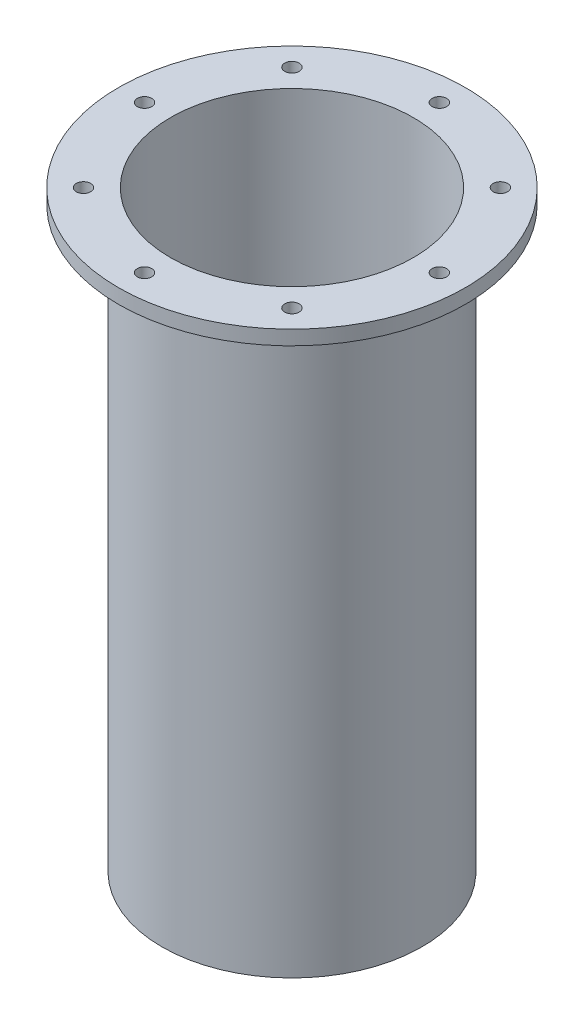
ISO-10303-21;
HEADER;
FILE_DESCRIPTION(('STEP AP214'),'2;1');
FILE_NAME('part.step','',(''),(''),'','','');
FILE_SCHEMA(('AUTOMOTIVE_DESIGN { 1 0 10303 214 1 1 1 1 }'));
ENDSEC;
DATA;
#1=APPLICATION_CONTEXT('core data for automotive mechanical design processes');
#2=APPLICATION_PROTOCOL_DEFINITION('international standard','automotive_design',2000,#1);
#3=PRODUCT_CONTEXT('',#1,'mechanical');
#4=PRODUCT('Part','Part','',(#3));
#5=PRODUCT_RELATED_PRODUCT_CATEGORY('part','',(#4));
#6=PRODUCT_DEFINITION_FORMATION('','',#4);
#7=PRODUCT_DEFINITION_CONTEXT('part definition',#1,'design');
#8=PRODUCT_DEFINITION('design','',#6,#7);
#9=PRODUCT_DEFINITION_SHAPE('','',#8);
#10=(LENGTH_UNIT() NAMED_UNIT(*) SI_UNIT(.MILLI.,.METRE.));
#11=(NAMED_UNIT(*) PLANE_ANGLE_UNIT() SI_UNIT($,.RADIAN.));
#12=(NAMED_UNIT(*) SI_UNIT($,.STERADIAN.) SOLID_ANGLE_UNIT());
#13=UNCERTAINTY_MEASURE_WITH_UNIT(LENGTH_MEASURE(1.E-05),#10,'distance_accuracy_value','');
#14=(GEOMETRIC_REPRESENTATION_CONTEXT(3) GLOBAL_UNCERTAINTY_ASSIGNED_CONTEXT((#13)) GLOBAL_UNIT_ASSIGNED_CONTEXT((#10,
#11,#12)) REPRESENTATION_CONTEXT('',''));
#15=CARTESIAN_POINT('',(0.,0.,0.));
#16=DIRECTION('',(0.,0.,1.));
#17=DIRECTION('',(1.,0.,0.));
#18=AXIS2_PLACEMENT_3D('',#15,#16,#17);
#19=CARTESIAN_POINT('',(0.,-260.35,0.));
#20=DIRECTION('',(0.,1.,0.));
#21=DIRECTION('',(0.,0.,1.));
#22=AXIS2_PLACEMENT_3D('',#19,#20,#21);
#23=CYLINDRICAL_SURFACE('',#22,57.15);
#24=CARTESIAN_POINT('',(0.,-260.35,0.));
#25=DIRECTION('',(0.,1.,0.));
#26=DIRECTION('',(0.,0.,1.));
#27=AXIS2_PLACEMENT_3D('',#24,#25,#26);
#28=CIRCLE('',#27,57.15);
#29=CARTESIAN_POINT('',(0.,-260.35,57.15));
#30=VERTEX_POINT('',#29);
#31=EDGE_CURVE('E10',#30,#30,#28,.T.);
#32=ORIENTED_EDGE('',*,*,#31,.T.);
#33=EDGE_LOOP('',(#32));
#34=FACE_BOUND('',#33,.T.);
#35=CARTESIAN_POINT('',(0.,-6.35,0.));
#36=DIRECTION('',(0.,1.,0.));
#37=DIRECTION('',(0.,0.,1.));
#38=AXIS2_PLACEMENT_3D('',#35,#36,#37);
#39=CIRCLE('',#38,57.15);
#40=CARTESIAN_POINT('',(0.,-6.35,57.15));
#41=VERTEX_POINT('',#40);
#42=EDGE_CURVE('E53',#41,#41,#39,.T.);
#43=ORIENTED_EDGE('',*,*,#42,.F.);
#44=EDGE_LOOP('',(#43));
#45=FACE_BOUND('',#44,.T.);
#46=ADVANCED_FACE('F33',(#34,#45),#23,.T.);
#47=CARTESIAN_POINT('',(0.,-260.35,0.));
#48=DIRECTION('',(0.,1.,0.));
#49=DIRECTION('',(0.,0.,1.));
#50=AXIS2_PLACEMENT_3D('',#47,#48,#49);
#51=PLANE('',#50);
#52=CARTESIAN_POINT('',(0.,-260.35,0.));
#53=DIRECTION('',(0.,1.,0.));
#54=DIRECTION('',(0.,0.,1.));
#55=AXIS2_PLACEMENT_3D('',#52,#53,#54);
#56=CIRCLE('',#55,53.34);
#57=CARTESIAN_POINT('',(0.,-260.35,53.34));
#58=VERTEX_POINT('',#57);
#59=EDGE_CURVE('E39',#58,#58,#56,.T.);
#60=ORIENTED_EDGE('',*,*,#59,.T.);
#61=EDGE_LOOP('',(#60));
#62=FACE_BOUND('',#61,.T.);
#63=ORIENTED_EDGE('',*,*,#31,.F.);
#64=EDGE_LOOP('',(#63));
#65=FACE_BOUND('',#64,.T.);
#66=ADVANCED_FACE('F114',(#62,#65),#51,.F.);
#67=CARTESIAN_POINT('',(0.,0.,0.));
#68=DIRECTION('',(0.,1.,0.));
#69=DIRECTION('',(0.,0.,1.));
#70=AXIS2_PLACEMENT_3D('',#67,#68,#69);
#71=PLANE('',#70);
#72=CARTESIAN_POINT('',(64.77,0.,2.2614324631687E-13));
#73=DIRECTION('',(0.,1.,0.));
#74=DIRECTION('',(-1.,0.,0.));
#75=AXIS2_PLACEMENT_3D('',#72,#73,#74);
#76=CIRCLE('',#75,3.175);
#77=CARTESIAN_POINT('',(61.595,0.,2.15057793066043E-13));
#78=VERTEX_POINT('',#77);
#79=EDGE_CURVE('E88',#78,#78,#76,.T.);
#80=ORIENTED_EDGE('',*,*,#79,.F.);
#81=EDGE_LOOP('',(#80));
#82=FACE_BOUND('',#81,.T.);
#83=CARTESIAN_POINT('',(45.7993062174524,0.,45.7993062174529));
#84=DIRECTION('',(0.,1.,0.));
#85=DIRECTION('',(-0.707106781186544,0.,-0.707106781186551));
#86=AXIS2_PLACEMENT_3D('',#83,#84,#85);
#87=CIRCLE('',#86,3.175);
#88=CARTESIAN_POINT('',(43.5542421871852,0.,43.5542421871856));
#89=VERTEX_POINT('',#88);
#90=EDGE_CURVE('E82',#89,#89,#87,.T.);
#91=ORIENTED_EDGE('',*,*,#90,.F.);
#92=EDGE_LOOP('',(#91));
#93=FACE_BOUND('',#92,.T.);
#94=CARTESIAN_POINT('',(0.,0.,64.77));
#95=DIRECTION('',(0.,1.,0.));
#96=DIRECTION('',(0.,0.,-1.));
#97=AXIS2_PLACEMENT_3D('',#94,#95,#96);
#98=CIRCLE('',#97,3.175);
#99=CARTESIAN_POINT('',(0.,0.,61.595));
#100=VERTEX_POINT('',#99);
#101=EDGE_CURVE('E74',#100,#100,#98,.T.);
#102=ORIENTED_EDGE('',*,*,#101,.F.);
#103=EDGE_LOOP('',(#102));
#104=FACE_BOUND('',#103,.T.);
#105=CARTESIAN_POINT('',(-45.7993062174531,0.,45.7993062174523));
#106=DIRECTION('',(0.,1.,0.));
#107=DIRECTION('',(0.707106781186554,0.,-0.707106781186541));
#108=AXIS2_PLACEMENT_3D('',#105,#106,#107);
#109=CIRCLE('',#108,3.175);
#110=CARTESIAN_POINT('',(-43.5542421871858,0.,43.554242187185));
#111=VERTEX_POINT('',#110);
#112=EDGE_CURVE('E75',#111,#111,#109,.T.);
#113=ORIENTED_EDGE('',*,*,#112,.F.);
#114=EDGE_LOOP('',(#113));
#115=FACE_BOUND('',#114,.T.);
#116=CARTESIAN_POINT('',(-64.77,0.,-6.78429738950609E-13));
#117=DIRECTION('',(0.,1.,0.));
#118=DIRECTION('',(1.,0.,0.));
#119=AXIS2_PLACEMENT_3D('',#116,#117,#118);
#120=CIRCLE('',#119,3.175);
#121=CARTESIAN_POINT('',(-61.595,0.,-6.45173379198128E-13));
#122=VERTEX_POINT('',#121);
#123=EDGE_CURVE('E98',#122,#122,#120,.T.);
#124=ORIENTED_EDGE('',*,*,#123,.F.);
#125=EDGE_LOOP('',(#124));
#126=FACE_BOUND('',#125,.T.);
#127=CARTESIAN_POINT('',(-45.7993062174521,0.,-45.7993062174532));
#128=DIRECTION('',(0.,1.,0.));
#129=DIRECTION('',(0.707106781186539,0.,0.707106781186556));
#130=AXIS2_PLACEMENT_3D('',#127,#128,#129);
#131=CIRCLE('',#130,3.175);
#132=CARTESIAN_POINT('',(-43.5542421871849,0.,-43.5542421871859));
#133=VERTEX_POINT('',#132);
#134=EDGE_CURVE('E99',#133,#133,#131,.T.);
#135=ORIENTED_EDGE('',*,*,#134,.F.);
#136=EDGE_LOOP('',(#135));
#137=FACE_BOUND('',#136,.T.);
#138=CARTESIAN_POINT('',(45.7993062174528,0.,-45.7993062174526));
#139=DIRECTION('',(0.,1.,0.));
#140=DIRECTION('',(-0.707106781186549,0.,0.707106781186546));
#141=AXIS2_PLACEMENT_3D('',#138,#139,#140);
#142=CIRCLE('',#141,3.175);
#143=CARTESIAN_POINT('',(43.5542421871855,0.,-43.5542421871853));
#144=VERTEX_POINT('',#143);
#145=EDGE_CURVE('E67',#144,#144,#142,.T.);
#146=ORIENTED_EDGE('',*,*,#145,.F.);
#147=EDGE_LOOP('',(#146));
#148=FACE_BOUND('',#147,.T.);
#149=CARTESIAN_POINT('',(0.,0.,-64.77));
#150=DIRECTION('',(0.,1.,0.));
#151=DIRECTION('',(0.,0.,1.));
#152=AXIS2_PLACEMENT_3D('',#149,#150,#151);
#153=CIRCLE('',#152,3.175);
#154=CARTESIAN_POINT('',(0.,0.,-61.595));
#155=VERTEX_POINT('',#154);
#156=EDGE_CURVE('E61',#155,#155,#153,.T.);
#157=ORIENTED_EDGE('',*,*,#156,.F.);
#158=EDGE_LOOP('',(#157));
#159=FACE_BOUND('',#158,.T.);
#160=CARTESIAN_POINT('',(0.,0.,0.));
#161=DIRECTION('',(0.,1.,0.));
#162=DIRECTION('',(0.,0.,1.));
#163=AXIS2_PLACEMENT_3D('',#160,#161,#162);
#164=CIRCLE('',#163,53.34);
#165=CARTESIAN_POINT('',(0.,0.,53.34));
#166=VERTEX_POINT('',#165);
#167=EDGE_CURVE('E43',#166,#166,#164,.T.);
#168=ORIENTED_EDGE('',*,*,#167,.F.);
#169=EDGE_LOOP('',(#168));
#170=FACE_BOUND('',#169,.T.);
#171=CARTESIAN_POINT('',(0.,0.,0.));
#172=DIRECTION('',(0.,1.,0.));
#173=DIRECTION('',(0.,0.,1.));
#174=AXIS2_PLACEMENT_3D('',#171,#172,#173);
#175=CIRCLE('',#174,76.2);
#176=CARTESIAN_POINT('',(0.,0.,76.2));
#177=VERTEX_POINT('',#176);
#178=EDGE_CURVE('E50',#177,#177,#175,.T.);
#179=ORIENTED_EDGE('',*,*,#178,.T.);
#180=EDGE_LOOP('',(#179));
#181=FACE_BOUND('',#180,.T.);
#182=ADVANCED_FACE('F110',(#82,#93,#104,#115,#126,#137,#148,#159,#170,#181),#71,.T.);
#183=CARTESIAN_POINT('',(0.,-260.35,0.));
#184=DIRECTION('',(0.,1.,0.));
#185=DIRECTION('',(0.,0.,1.));
#186=AXIS2_PLACEMENT_3D('',#183,#184,#185);
#187=CYLINDRICAL_SURFACE('',#186,53.34);
#188=ORIENTED_EDGE('',*,*,#59,.F.);
#189=EDGE_LOOP('',(#188));
#190=FACE_BOUND('',#189,.T.);
#191=ORIENTED_EDGE('',*,*,#167,.T.);
#192=EDGE_LOOP('',(#191));
#193=FACE_BOUND('',#192,.T.);
#194=ADVANCED_FACE('F113',(#190,#193),#187,.F.);
#195=CARTESIAN_POINT('',(0.,-6.35,0.));
#196=DIRECTION('',(0.,1.,0.));
#197=DIRECTION('',(0.,0.,1.));
#198=AXIS2_PLACEMENT_3D('',#195,#196,#197);
#199=CYLINDRICAL_SURFACE('',#198,76.2);
#200=CARTESIAN_POINT('',(0.,-6.35,0.));
#201=DIRECTION('',(0.,1.,0.));
#202=DIRECTION('',(0.,0.,1.));
#203=AXIS2_PLACEMENT_3D('',#200,#201,#202);
#204=CIRCLE('',#203,76.2);
#205=CARTESIAN_POINT('',(0.,-6.35,76.2));
#206=VERTEX_POINT('',#205);
#207=EDGE_CURVE('E48',#206,#206,#204,.T.);
#208=ORIENTED_EDGE('',*,*,#207,.T.);
#209=EDGE_LOOP('',(#208));
#210=FACE_BOUND('',#209,.T.);
#211=ORIENTED_EDGE('',*,*,#178,.F.);
#212=EDGE_LOOP('',(#211));
#213=FACE_BOUND('',#212,.T.);
#214=ADVANCED_FACE('F126',(#210,#213),#199,.T.);
#215=CARTESIAN_POINT('',(0.,-6.35,0.));
#216=DIRECTION('',(0.,1.,0.));
#217=DIRECTION('',(0.,0.,1.));
#218=AXIS2_PLACEMENT_3D('',#215,#216,#217);
#219=PLANE('',#218);
#220=CARTESIAN_POINT('',(64.77,-6.35000000000002,2.2614324631687E-13));
#221=DIRECTION('',(0.,1.,0.));
#222=DIRECTION('',(0.,0.,1.));
#223=AXIS2_PLACEMENT_3D('',#220,#221,#222);
#224=CIRCLE('',#223,3.175);
#225=CARTESIAN_POINT('',(64.77,-6.35000000000002,3.17500000000022));
#226=VERTEX_POINT('',#225);
#227=EDGE_CURVE('E70',#226,#226,#224,.F.);
#228=ORIENTED_EDGE('',*,*,#227,.F.);
#229=EDGE_LOOP('',(#228));
#230=FACE_BOUND('',#229,.T.);
#231=CARTESIAN_POINT('',(45.7993062174524,-6.35000000000002,45.7993062174529));
#232=DIRECTION('',(0.,1.,0.));
#233=DIRECTION('',(0.,0.,1.));
#234=AXIS2_PLACEMENT_3D('',#231,#232,#233);
#235=CIRCLE('',#234,3.175);
#236=CARTESIAN_POINT('',(45.7993062174524,-6.35000000000002,48.9743062174529));
#237=VERTEX_POINT('',#236);
#238=EDGE_CURVE('E85',#237,#237,#235,.F.);
#239=ORIENTED_EDGE('',*,*,#238,.F.);
#240=EDGE_LOOP('',(#239));
#241=FACE_BOUND('',#240,.T.);
#242=CARTESIAN_POINT('',(0.,-6.35000000000002,64.77));
#243=DIRECTION('',(0.,1.,0.));
#244=DIRECTION('',(0.,0.,1.));
#245=AXIS2_PLACEMENT_3D('',#242,#243,#244);
#246=CIRCLE('',#245,3.175);
#247=CARTESIAN_POINT('',(0.,-6.35000000000002,67.945));
#248=VERTEX_POINT('',#247);
#249=EDGE_CURVE('E79',#248,#248,#246,.F.);
#250=ORIENTED_EDGE('',*,*,#249,.F.);
#251=EDGE_LOOP('',(#250));
#252=FACE_BOUND('',#251,.T.);
#253=CARTESIAN_POINT('',(-45.7993062174531,-6.35000000000002,45.7993062174523));
#254=DIRECTION('',(0.,1.,0.));
#255=DIRECTION('',(0.,0.,1.));
#256=AXIS2_PLACEMENT_3D('',#253,#254,#255);
#257=CIRCLE('',#256,3.175);
#258=CARTESIAN_POINT('',(-45.7993062174531,-6.35000000000002,48.9743062174523));
#259=VERTEX_POINT('',#258);
#260=EDGE_CURVE('E71',#259,#259,#257,.F.);
#261=ORIENTED_EDGE('',*,*,#260,.F.);
#262=EDGE_LOOP('',(#261));
#263=FACE_BOUND('',#262,.T.);
#264=CARTESIAN_POINT('',(-64.77,-6.35000000000002,-6.78429738950609E-13));
#265=DIRECTION('',(0.,1.,0.));
#266=DIRECTION('',(0.,0.,1.));
#267=AXIS2_PLACEMENT_3D('',#264,#265,#266);
#268=CIRCLE('',#267,3.175);
#269=CARTESIAN_POINT('',(-64.77,-6.35000000000002,3.17499999999932));
#270=VERTEX_POINT('',#269);
#271=EDGE_CURVE('E78',#270,#270,#268,.F.);
#272=ORIENTED_EDGE('',*,*,#271,.F.);
#273=EDGE_LOOP('',(#272));
#274=FACE_BOUND('',#273,.T.);
#275=CARTESIAN_POINT('',(-45.7993062174521,-6.35000000000002,-45.7993062174532));
#276=DIRECTION('',(0.,1.,0.));
#277=DIRECTION('',(0.,0.,1.));
#278=AXIS2_PLACEMENT_3D('',#275,#276,#277);
#279=CIRCLE('',#278,3.175);
#280=CARTESIAN_POINT('',(-45.7993062174521,-6.35000000000002,-42.6243062174532));
#281=VERTEX_POINT('',#280);
#282=EDGE_CURVE('E95',#281,#281,#279,.F.);
#283=ORIENTED_EDGE('',*,*,#282,.F.);
#284=EDGE_LOOP('',(#283));
#285=FACE_BOUND('',#284,.T.);
#286=CARTESIAN_POINT('',(45.7993062174528,-6.35000000000002,-45.7993062174526));
#287=DIRECTION('',(0.,1.,0.));
#288=DIRECTION('',(0.,0.,1.));
#289=AXIS2_PLACEMENT_3D('',#286,#287,#288);
#290=CIRCLE('',#289,3.175);
#291=CARTESIAN_POINT('',(45.7993062174528,-6.35000000000002,-42.6243062174526));
#292=VERTEX_POINT('',#291);
#293=EDGE_CURVE('E64',#292,#292,#290,.F.);
#294=ORIENTED_EDGE('',*,*,#293,.F.);
#295=EDGE_LOOP('',(#294));
#296=FACE_BOUND('',#295,.T.);
#297=CARTESIAN_POINT('',(0.,-6.35000000000002,-64.77));
#298=DIRECTION('',(0.,1.,0.));
#299=DIRECTION('',(0.,0.,1.));
#300=AXIS2_PLACEMENT_3D('',#297,#298,#299);
#301=CIRCLE('',#300,3.175);
#302=CARTESIAN_POINT('',(0.,-6.35000000000002,-61.595));
#303=VERTEX_POINT('',#302);
#304=EDGE_CURVE('E58',#303,#303,#301,.F.);
#305=ORIENTED_EDGE('',*,*,#304,.F.);
#306=EDGE_LOOP('',(#305));
#307=FACE_BOUND('',#306,.T.);
#308=ORIENTED_EDGE('',*,*,#42,.T.);
#309=EDGE_LOOP('',(#308));
#310=FACE_BOUND('',#309,.T.);
#311=ORIENTED_EDGE('',*,*,#207,.F.);
#312=EDGE_LOOP('',(#311));
#313=FACE_BOUND('',#312,.T.);
#314=ADVANCED_FACE('F128',(#230,#241,#252,#263,#274,#285,#296,#307,#310,#313),#219,.F.);
#315=CARTESIAN_POINT('',(0.,-260.351,-64.77));
#316=DIRECTION('',(0.,1.,0.));
#317=DIRECTION('',(0.,0.,1.));
#318=AXIS2_PLACEMENT_3D('',#315,#316,#317);
#319=CYLINDRICAL_SURFACE('',#318,3.175);
#320=ORIENTED_EDGE('',*,*,#156,.T.);
#321=EDGE_LOOP('',(#320));
#322=FACE_BOUND('',#321,.T.);
#323=ORIENTED_EDGE('',*,*,#304,.T.);
#324=EDGE_LOOP('',(#323));
#325=FACE_BOUND('',#324,.T.);
#326=ADVANCED_FACE('F135',(#322,#325),#319,.F.);
#327=CARTESIAN_POINT('',(45.7993062174528,-260.351,-45.7993062174526));
#328=DIRECTION('',(0.,1.,0.));
#329=DIRECTION('',(0.,0.,1.));
#330=AXIS2_PLACEMENT_3D('',#327,#328,#329);
#331=CYLINDRICAL_SURFACE('',#330,3.175);
#332=ORIENTED_EDGE('',*,*,#145,.T.);
#333=EDGE_LOOP('',(#332));
#334=FACE_BOUND('',#333,.T.);
#335=ORIENTED_EDGE('',*,*,#293,.T.);
#336=EDGE_LOOP('',(#335));
#337=FACE_BOUND('',#336,.T.);
#338=ADVANCED_FACE('F180',(#334,#337),#331,.F.);
#339=CARTESIAN_POINT('',(-45.7993062174521,-260.351,-45.7993062174532));
#340=DIRECTION('',(0.,1.,0.));
#341=DIRECTION('',(0.,0.,1.));
#342=AXIS2_PLACEMENT_3D('',#339,#340,#341);
#343=CYLINDRICAL_SURFACE('',#342,3.175);
#344=ORIENTED_EDGE('',*,*,#134,.T.);
#345=EDGE_LOOP('',(#344));
#346=FACE_BOUND('',#345,.T.);
#347=ORIENTED_EDGE('',*,*,#282,.T.);
#348=EDGE_LOOP('',(#347));
#349=FACE_BOUND('',#348,.T.);
#350=ADVANCED_FACE('F192',(#346,#349),#343,.F.);
#351=CARTESIAN_POINT('',(-64.77,-260.351,-6.78429738950609E-13));
#352=DIRECTION('',(0.,1.,0.));
#353=DIRECTION('',(0.,0.,1.));
#354=AXIS2_PLACEMENT_3D('',#351,#352,#353);
#355=CYLINDRICAL_SURFACE('',#354,3.175);
#356=ORIENTED_EDGE('',*,*,#123,.T.);
#357=EDGE_LOOP('',(#356));
#358=FACE_BOUND('',#357,.T.);
#359=ORIENTED_EDGE('',*,*,#271,.T.);
#360=EDGE_LOOP('',(#359));
#361=FACE_BOUND('',#360,.T.);
#362=ADVANCED_FACE('F107',(#358,#361),#355,.F.);
#363=CARTESIAN_POINT('',(-45.7993062174531,-260.351,45.7993062174523));
#364=DIRECTION('',(0.,1.,0.));
#365=DIRECTION('',(0.,0.,1.));
#366=AXIS2_PLACEMENT_3D('',#363,#364,#365);
#367=CYLINDRICAL_SURFACE('',#366,3.175);
#368=ORIENTED_EDGE('',*,*,#112,.T.);
#369=EDGE_LOOP('',(#368));
#370=FACE_BOUND('',#369,.T.);
#371=ORIENTED_EDGE('',*,*,#260,.T.);
#372=EDGE_LOOP('',(#371));
#373=FACE_BOUND('',#372,.T.);
#374=ADVANCED_FACE('F206',(#370,#373),#367,.F.);
#375=CARTESIAN_POINT('',(0.,-260.351,64.77));
#376=DIRECTION('',(0.,1.,0.));
#377=DIRECTION('',(0.,0.,1.));
#378=AXIS2_PLACEMENT_3D('',#375,#376,#377);
#379=CYLINDRICAL_SURFACE('',#378,3.175);
#380=ORIENTED_EDGE('',*,*,#101,.T.);
#381=EDGE_LOOP('',(#380));
#382=FACE_BOUND('',#381,.T.);
#383=ORIENTED_EDGE('',*,*,#249,.T.);
#384=EDGE_LOOP('',(#383));
#385=FACE_BOUND('',#384,.T.);
#386=ADVANCED_FACE('F213',(#382,#385),#379,.F.);
#387=CARTESIAN_POINT('',(45.7993062174524,-260.351,45.7993062174529));
#388=DIRECTION('',(0.,1.,0.));
#389=DIRECTION('',(0.,0.,1.));
#390=AXIS2_PLACEMENT_3D('',#387,#388,#389);
#391=CYLINDRICAL_SURFACE('',#390,3.175);
#392=ORIENTED_EDGE('',*,*,#90,.T.);
#393=EDGE_LOOP('',(#392));
#394=FACE_BOUND('',#393,.T.);
#395=ORIENTED_EDGE('',*,*,#238,.T.);
#396=EDGE_LOOP('',(#395));
#397=FACE_BOUND('',#396,.T.);
#398=ADVANCED_FACE('F221',(#394,#397),#391,.F.);
#399=CARTESIAN_POINT('',(64.77,-260.351,2.2614324631687E-13));
#400=DIRECTION('',(0.,1.,0.));
#401=DIRECTION('',(0.,0.,1.));
#402=AXIS2_PLACEMENT_3D('',#399,#400,#401);
#403=CYLINDRICAL_SURFACE('',#402,3.175);
#404=ORIENTED_EDGE('',*,*,#79,.T.);
#405=EDGE_LOOP('',(#404));
#406=FACE_BOUND('',#405,.T.);
#407=ORIENTED_EDGE('',*,*,#227,.T.);
#408=EDGE_LOOP('',(#407));
#409=FACE_BOUND('',#408,.T.);
#410=ADVANCED_FACE('F229',(#406,#409),#403,.F.);
#411=CLOSED_SHELL('',(#46,#66,#182,#194,#214,#314,#326,#338,#350,#362,#374,#386,#398,#410));
#412=MANIFOLD_SOLID_BREP('B2',#411);
#413=ADVANCED_BREP_SHAPE_REPRESENTATION('',(#18,#412),#14);
#414=SHAPE_DEFINITION_REPRESENTATION(#9,#413);
ENDSEC;
END-ISO-10303-21;
